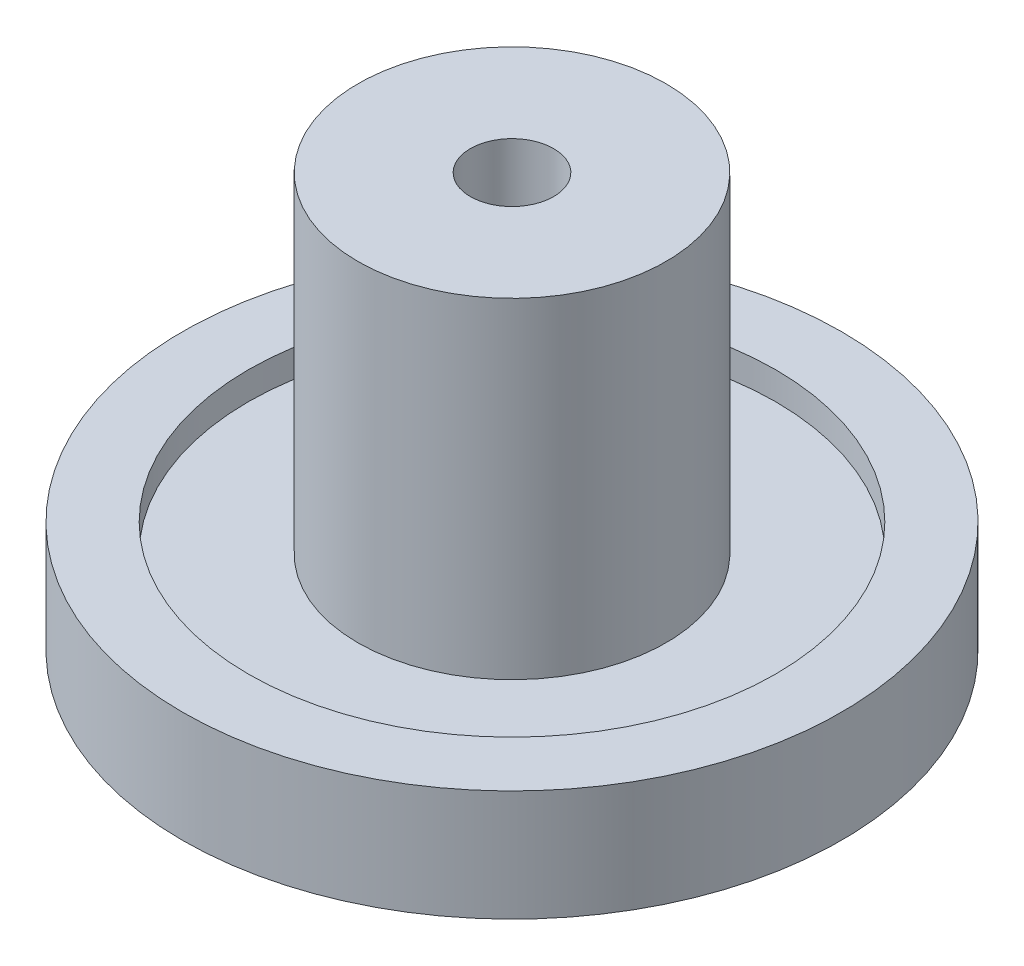
ISO-10303-21;
HEADER;
FILE_DESCRIPTION(('STEP AP214'),'2;1');
FILE_NAME('part.step','',(''),(''),'','','');
FILE_SCHEMA(('AUTOMOTIVE_DESIGN { 1 0 10303 214 1 1 1 1 }'));
ENDSEC;
DATA;
#1=APPLICATION_CONTEXT('core data for automotive mechanical design processes');
#2=APPLICATION_PROTOCOL_DEFINITION('international standard','automotive_design',2000,#1);
#3=PRODUCT_CONTEXT('',#1,'mechanical');
#4=PRODUCT('Part','Part','',(#3));
#5=PRODUCT_RELATED_PRODUCT_CATEGORY('part','',(#4));
#6=PRODUCT_DEFINITION_FORMATION('','',#4);
#7=PRODUCT_DEFINITION_CONTEXT('part definition',#1,'design');
#8=PRODUCT_DEFINITION('design','',#6,#7);
#9=PRODUCT_DEFINITION_SHAPE('','',#8);
#10=(LENGTH_UNIT() NAMED_UNIT(*) SI_UNIT(.MILLI.,.METRE.));
#11=(NAMED_UNIT(*) PLANE_ANGLE_UNIT() SI_UNIT($,.RADIAN.));
#12=(NAMED_UNIT(*) SI_UNIT($,.STERADIAN.) SOLID_ANGLE_UNIT());
#13=UNCERTAINTY_MEASURE_WITH_UNIT(LENGTH_MEASURE(1.E-05),#10,'distance_accuracy_value','');
#14=(GEOMETRIC_REPRESENTATION_CONTEXT(3) GLOBAL_UNCERTAINTY_ASSIGNED_CONTEXT((#13)) GLOBAL_UNIT_ASSIGNED_CONTEXT((#10,
#11,#12)) REPRESENTATION_CONTEXT('',''));
#15=CARTESIAN_POINT('',(0.,0.,0.));
#16=DIRECTION('',(0.,0.,1.));
#17=DIRECTION('',(1.,0.,0.));
#18=AXIS2_PLACEMENT_3D('',#15,#16,#17);
#19=CARTESIAN_POINT('',(5.55,14.9,0.));
#20=DIRECTION('',(0.,1.,0.));
#21=DIRECTION('',(0.,0.,1.));
#22=AXIS2_PLACEMENT_3D('',#19,#20,#21);
#23=PLANE('',#22);
#24=CARTESIAN_POINT('',(0.,14.9,0.));
#25=DIRECTION('',(0.,-1.,0.));
#26=DIRECTION('',(0.,0.,-1.));
#27=AXIS2_PLACEMENT_3D('',#24,#25,#26);
#28=CIRCLE('',#27,1.50000000000001);
#29=CARTESIAN_POINT('',(0.,14.9,-1.50000000000001));
#30=VERTEX_POINT('',#29);
#31=EDGE_CURVE('E10',#30,#30,#28,.T.);
#32=ORIENTED_EDGE('',*,*,#31,.T.);
#33=EDGE_LOOP('',(#32));
#34=FACE_BOUND('',#33,.T.);
#35=CARTESIAN_POINT('',(0.,14.9,0.));
#36=DIRECTION('',(0.,-1.,0.));
#37=DIRECTION('',(0.,0.,-1.));
#38=AXIS2_PLACEMENT_3D('',#35,#36,#37);
#39=CIRCLE('',#38,5.55);
#40=CARTESIAN_POINT('',(0.,14.9,-5.55));
#41=VERTEX_POINT('',#40);
#42=EDGE_CURVE('E86',#41,#41,#39,.T.);
#43=ORIENTED_EDGE('',*,*,#42,.F.);
#44=EDGE_LOOP('',(#43));
#45=FACE_BOUND('',#44,.T.);
#46=ADVANCED_FACE('F38',(#34,#45),#23,.T.);
#47=CARTESIAN_POINT('',(0.,0.,0.));
#48=DIRECTION('',(0.,-1.,0.));
#49=DIRECTION('',(0.,0.,-1.));
#50=AXIS2_PLACEMENT_3D('',#47,#48,#49);
#51=CYLINDRICAL_SURFACE('',#50,1.50000000000001);
#52=CARTESIAN_POINT('',(0.,0.,0.));
#53=DIRECTION('',(0.,-1.,0.));
#54=DIRECTION('',(0.,0.,-1.));
#55=AXIS2_PLACEMENT_3D('',#52,#53,#54);
#56=CIRCLE('',#55,1.50000000000001);
#57=CARTESIAN_POINT('',(0.,0.,-1.50000000000001));
#58=VERTEX_POINT('',#57);
#59=EDGE_CURVE('E44',#58,#58,#56,.T.);
#60=ORIENTED_EDGE('',*,*,#59,.T.);
#61=EDGE_LOOP('',(#60));
#62=FACE_BOUND('',#61,.T.);
#63=ORIENTED_EDGE('',*,*,#31,.F.);
#64=EDGE_LOOP('',(#63));
#65=FACE_BOUND('',#64,.T.);
#66=ADVANCED_FACE('F95',(#62,#65),#51,.F.);
#67=CARTESIAN_POINT('',(1.50000000000001,0.,0.));
#68=DIRECTION('',(0.,-1.,0.));
#69=DIRECTION('',(0.,0.,-1.));
#70=AXIS2_PLACEMENT_3D('',#67,#68,#69);
#71=PLANE('',#70);
#72=CARTESIAN_POINT('',(0.,0.,0.));
#73=DIRECTION('',(0.,-1.,0.));
#74=DIRECTION('',(0.,0.,-1.));
#75=AXIS2_PLACEMENT_3D('',#72,#73,#74);
#76=CIRCLE('',#75,3.5);
#77=CARTESIAN_POINT('',(0.,0.,-3.5));
#78=VERTEX_POINT('',#77);
#79=EDGE_CURVE('E48',#78,#78,#76,.T.);
#80=ORIENTED_EDGE('',*,*,#79,.T.);
#81=EDGE_LOOP('',(#80));
#82=FACE_BOUND('',#81,.T.);
#83=ORIENTED_EDGE('',*,*,#59,.F.);
#84=EDGE_LOOP('',(#83));
#85=FACE_BOUND('',#84,.T.);
#86=ADVANCED_FACE('F99',(#82,#85),#71,.T.);
#87=CARTESIAN_POINT('',(0.,0.,0.));
#88=DIRECTION('',(0.,-1.,0.));
#89=DIRECTION('',(0.,0.,-1.));
#90=AXIS2_PLACEMENT_3D('',#87,#88,#89);
#91=CYLINDRICAL_SURFACE('',#90,3.5);
#92=CARTESIAN_POINT('',(0.,1.2,0.));
#93=DIRECTION('',(0.,-1.,0.));
#94=DIRECTION('',(0.,0.,-1.));
#95=AXIS2_PLACEMENT_3D('',#92,#93,#94);
#96=CIRCLE('',#95,3.5);
#97=CARTESIAN_POINT('',(0.,1.2,-3.5));
#98=VERTEX_POINT('',#97);
#99=EDGE_CURVE('E52',#98,#98,#96,.T.);
#100=ORIENTED_EDGE('',*,*,#99,.T.);
#101=EDGE_LOOP('',(#100));
#102=FACE_BOUND('',#101,.T.);
#103=ORIENTED_EDGE('',*,*,#79,.F.);
#104=EDGE_LOOP('',(#103));
#105=FACE_BOUND('',#104,.T.);
#106=ADVANCED_FACE('F103',(#102,#105),#91,.T.);
#107=CARTESIAN_POINT('',(3.5,1.2,0.));
#108=DIRECTION('',(0.,-1.,0.));
#109=DIRECTION('',(0.,0.,-1.));
#110=AXIS2_PLACEMENT_3D('',#107,#108,#109);
#111=PLANE('',#110);
#112=CARTESIAN_POINT('',(0.,1.2,0.));
#113=DIRECTION('',(0.,-1.,0.));
#114=DIRECTION('',(0.,0.,-1.));
#115=AXIS2_PLACEMENT_3D('',#112,#113,#114);
#116=CIRCLE('',#115,9.5);
#117=CARTESIAN_POINT('',(0.,1.2,-9.5));
#118=VERTEX_POINT('',#117);
#119=EDGE_CURVE('E58',#118,#118,#116,.T.);
#120=ORIENTED_EDGE('',*,*,#119,.T.);
#121=EDGE_LOOP('',(#120));
#122=FACE_BOUND('',#121,.T.);
#123=ORIENTED_EDGE('',*,*,#99,.F.);
#124=EDGE_LOOP('',(#123));
#125=FACE_BOUND('',#124,.T.);
#126=ADVANCED_FACE('F110',(#122,#125),#111,.T.);
#127=CARTESIAN_POINT('',(0.,0.,0.));
#128=DIRECTION('',(0.,-1.,0.));
#129=DIRECTION('',(0.,0.,-1.));
#130=AXIS2_PLACEMENT_3D('',#127,#128,#129);
#131=CYLINDRICAL_SURFACE('',#130,9.5);
#132=CARTESIAN_POINT('',(0.,0.,0.));
#133=DIRECTION('',(0.,-1.,0.));
#134=DIRECTION('',(0.,0.,-1.));
#135=AXIS2_PLACEMENT_3D('',#132,#133,#134);
#136=CIRCLE('',#135,9.5);
#137=CARTESIAN_POINT('',(0.,0.,-9.5));
#138=VERTEX_POINT('',#137);
#139=EDGE_CURVE('E62',#138,#138,#136,.T.);
#140=ORIENTED_EDGE('',*,*,#139,.T.);
#141=EDGE_LOOP('',(#140));
#142=FACE_BOUND('',#141,.T.);
#143=ORIENTED_EDGE('',*,*,#119,.F.);
#144=EDGE_LOOP('',(#143));
#145=FACE_BOUND('',#144,.T.);
#146=ADVANCED_FACE('F114',(#142,#145),#131,.F.);
#147=CARTESIAN_POINT('',(9.5,0.,0.));
#148=DIRECTION('',(0.,-1.,0.));
#149=DIRECTION('',(0.,0.,-1.));
#150=AXIS2_PLACEMENT_3D('',#147,#148,#149);
#151=PLANE('',#150);
#152=CARTESIAN_POINT('',(0.,0.,0.));
#153=DIRECTION('',(0.,-1.,0.));
#154=DIRECTION('',(0.,0.,-1.));
#155=AXIS2_PLACEMENT_3D('',#152,#153,#154);
#156=CIRCLE('',#155,11.875);
#157=CARTESIAN_POINT('',(0.,0.,-11.875));
#158=VERTEX_POINT('',#157);
#159=EDGE_CURVE('E66',#158,#158,#156,.T.);
#160=ORIENTED_EDGE('',*,*,#159,.T.);
#161=EDGE_LOOP('',(#160));
#162=FACE_BOUND('',#161,.T.);
#163=ORIENTED_EDGE('',*,*,#139,.F.);
#164=EDGE_LOOP('',(#163));
#165=FACE_BOUND('',#164,.T.);
#166=ADVANCED_FACE('F118',(#162,#165),#151,.T.);
#167=CARTESIAN_POINT('',(0.,0.,0.));
#168=DIRECTION('',(0.,-1.,0.));
#169=DIRECTION('',(0.,0.,-1.));
#170=AXIS2_PLACEMENT_3D('',#167,#168,#169);
#171=CYLINDRICAL_SURFACE('',#170,11.875);
#172=CARTESIAN_POINT('',(0.,4.,0.));
#173=DIRECTION('',(0.,-1.,0.));
#174=DIRECTION('',(0.,0.,-1.));
#175=AXIS2_PLACEMENT_3D('',#172,#173,#174);
#176=CIRCLE('',#175,11.875);
#177=CARTESIAN_POINT('',(0.,4.,-11.875));
#178=VERTEX_POINT('',#177);
#179=EDGE_CURVE('E70',#178,#178,#176,.T.);
#180=ORIENTED_EDGE('',*,*,#179,.T.);
#181=EDGE_LOOP('',(#180));
#182=FACE_BOUND('',#181,.T.);
#183=ORIENTED_EDGE('',*,*,#159,.F.);
#184=EDGE_LOOP('',(#183));
#185=FACE_BOUND('',#184,.T.);
#186=ADVANCED_FACE('F122',(#182,#185),#171,.T.);
#187=CARTESIAN_POINT('',(11.875,4.,0.));
#188=DIRECTION('',(0.,1.,0.));
#189=DIRECTION('',(0.,0.,1.));
#190=AXIS2_PLACEMENT_3D('',#187,#188,#189);
#191=PLANE('',#190);
#192=CARTESIAN_POINT('',(0.,4.,0.));
#193=DIRECTION('',(0.,-1.,0.));
#194=DIRECTION('',(0.,0.,-1.));
#195=AXIS2_PLACEMENT_3D('',#192,#193,#194);
#196=CIRCLE('',#195,9.5);
#197=CARTESIAN_POINT('',(0.,4.,-9.5));
#198=VERTEX_POINT('',#197);
#199=EDGE_CURVE('E74',#198,#198,#196,.T.);
#200=ORIENTED_EDGE('',*,*,#199,.T.);
#201=EDGE_LOOP('',(#200));
#202=FACE_BOUND('',#201,.T.);
#203=ORIENTED_EDGE('',*,*,#179,.F.);
#204=EDGE_LOOP('',(#203));
#205=FACE_BOUND('',#204,.T.);
#206=ADVANCED_FACE('F126',(#202,#205),#191,.T.);
#207=CARTESIAN_POINT('',(0.,0.,0.));
#208=DIRECTION('',(0.,-1.,0.));
#209=DIRECTION('',(0.,0.,-1.));
#210=AXIS2_PLACEMENT_3D('',#207,#208,#209);
#211=CYLINDRICAL_SURFACE('',#210,9.5);
#212=CARTESIAN_POINT('',(0.,3.,0.));
#213=DIRECTION('',(0.,-1.,0.));
#214=DIRECTION('',(0.,0.,-1.));
#215=AXIS2_PLACEMENT_3D('',#212,#213,#214);
#216=CIRCLE('',#215,9.5);
#217=CARTESIAN_POINT('',(0.,3.,-9.5));
#218=VERTEX_POINT('',#217);
#219=EDGE_CURVE('E78',#218,#218,#216,.T.);
#220=ORIENTED_EDGE('',*,*,#219,.T.);
#221=EDGE_LOOP('',(#220));
#222=FACE_BOUND('',#221,.T.);
#223=ORIENTED_EDGE('',*,*,#199,.F.);
#224=EDGE_LOOP('',(#223));
#225=FACE_BOUND('',#224,.T.);
#226=ADVANCED_FACE('F130',(#222,#225),#211,.F.);
#227=CARTESIAN_POINT('',(9.5,3.,0.));
#228=DIRECTION('',(0.,1.,0.));
#229=DIRECTION('',(0.,0.,1.));
#230=AXIS2_PLACEMENT_3D('',#227,#228,#229);
#231=PLANE('',#230);
#232=CARTESIAN_POINT('',(0.,3.,0.));
#233=DIRECTION('',(0.,-1.,0.));
#234=DIRECTION('',(0.,0.,-1.));
#235=AXIS2_PLACEMENT_3D('',#232,#233,#234);
#236=CIRCLE('',#235,5.55);
#237=CARTESIAN_POINT('',(0.,3.,-5.55));
#238=VERTEX_POINT('',#237);
#239=EDGE_CURVE('E82',#238,#238,#236,.T.);
#240=ORIENTED_EDGE('',*,*,#239,.T.);
#241=EDGE_LOOP('',(#240));
#242=FACE_BOUND('',#241,.T.);
#243=ORIENTED_EDGE('',*,*,#219,.F.);
#244=EDGE_LOOP('',(#243));
#245=FACE_BOUND('',#244,.T.);
#246=ADVANCED_FACE('F134',(#242,#245),#231,.T.);
#247=CARTESIAN_POINT('',(0.,0.,0.));
#248=DIRECTION('',(0.,-1.,0.));
#249=DIRECTION('',(0.,0.,-1.));
#250=AXIS2_PLACEMENT_3D('',#247,#248,#249);
#251=CYLINDRICAL_SURFACE('',#250,5.55);
#252=ORIENTED_EDGE('',*,*,#42,.T.);
#253=EDGE_LOOP('',(#252));
#254=FACE_BOUND('',#253,.T.);
#255=ORIENTED_EDGE('',*,*,#239,.F.);
#256=EDGE_LOOP('',(#255));
#257=FACE_BOUND('',#256,.T.);
#258=ADVANCED_FACE('F91',(#254,#257),#251,.T.);
#259=CLOSED_SHELL('',(#46,#66,#86,#106,#126,#146,#166,#186,#206,#226,#246,#258));
#260=MANIFOLD_SOLID_BREP('B2',#259);
#261=ADVANCED_BREP_SHAPE_REPRESENTATION('',(#18,#260),#14);
#262=SHAPE_DEFINITION_REPRESENTATION(#9,#261);
ENDSEC;
END-ISO-10303-21;
